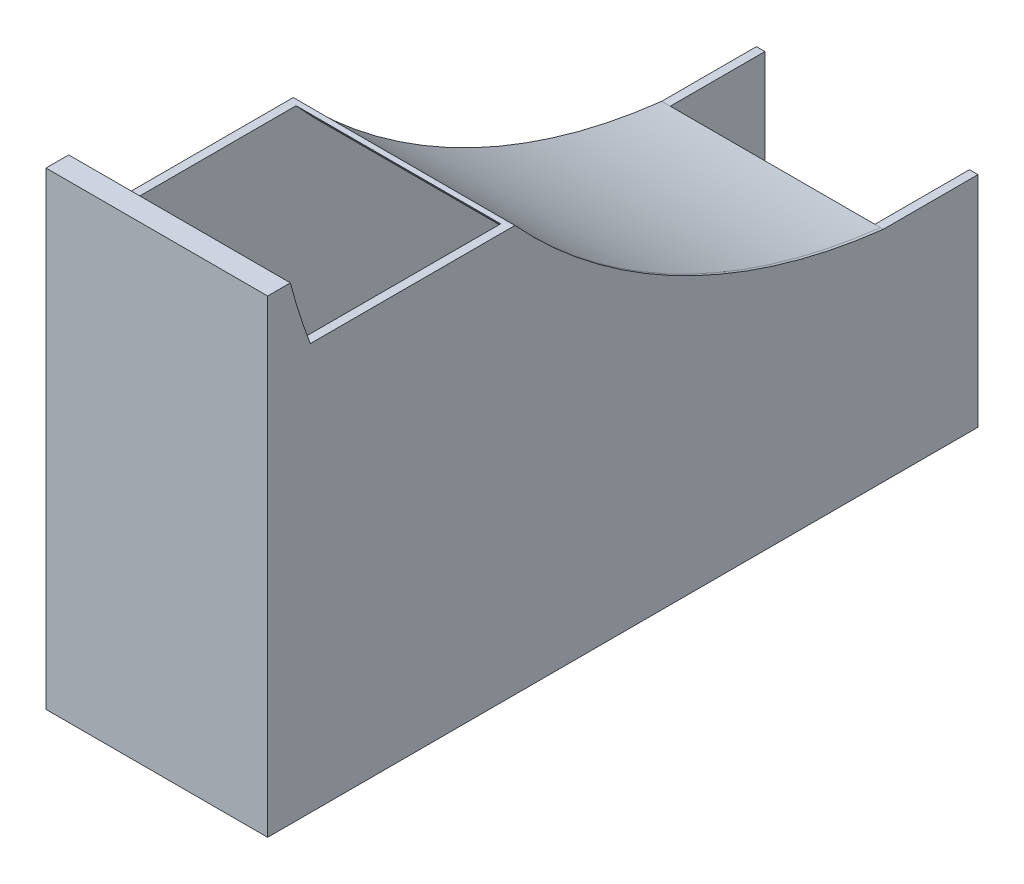
ISO-10303-21;
HEADER;
FILE_DESCRIPTION(('STEP AP214'),'2;1');
FILE_NAME('part.step','',(''),(''),'','','');
FILE_SCHEMA(('AUTOMOTIVE_DESIGN { 1 0 10303 214 1 1 1 1 }'));
ENDSEC;
DATA;
#1=APPLICATION_CONTEXT('core data for automotive mechanical design processes');
#2=APPLICATION_PROTOCOL_DEFINITION('international standard','automotive_design',2000,#1);
#3=PRODUCT_CONTEXT('',#1,'mechanical');
#4=PRODUCT('Part','Part','',(#3));
#5=PRODUCT_RELATED_PRODUCT_CATEGORY('part','',(#4));
#6=PRODUCT_DEFINITION_FORMATION('','',#4);
#7=PRODUCT_DEFINITION_CONTEXT('part definition',#1,'design');
#8=PRODUCT_DEFINITION('design','',#6,#7);
#9=PRODUCT_DEFINITION_SHAPE('','',#8);
#10=(LENGTH_UNIT() NAMED_UNIT(*) SI_UNIT(.MILLI.,.METRE.));
#11=(NAMED_UNIT(*) PLANE_ANGLE_UNIT() SI_UNIT($,.RADIAN.));
#12=(NAMED_UNIT(*) SI_UNIT($,.STERADIAN.) SOLID_ANGLE_UNIT());
#13=UNCERTAINTY_MEASURE_WITH_UNIT(LENGTH_MEASURE(1.E-05),#10,'distance_accuracy_value','');
#14=(GEOMETRIC_REPRESENTATION_CONTEXT(3) GLOBAL_UNCERTAINTY_ASSIGNED_CONTEXT((#13)) GLOBAL_UNIT_ASSIGNED_CONTEXT((#10,
#11,#12)) REPRESENTATION_CONTEXT('',''));
#15=CARTESIAN_POINT('',(0.,0.,0.));
#16=DIRECTION('',(0.,0.,1.));
#17=DIRECTION('',(1.,0.,0.));
#18=AXIS2_PLACEMENT_3D('',#15,#16,#17);
#19=CARTESIAN_POINT('',(17.177257831237,21.9262078687684,0.));
#20=DIRECTION('',(0.,1.,0.));
#21=DIRECTION('',(0.,0.,1.));
#22=AXIS2_PLACEMENT_3D('',#19,#20,#21);
#23=PLANE('',#22);
#24=DIRECTION('',(0.,0.,1.));
#25=VECTOR('',#24,1.);
#26=CARTESIAN_POINT('',(17.177257831237,21.9262078687684,0.));
#27=LINE('',#26,#25);
#28=CARTESIAN_POINT('',(17.177257831237,21.9262078687684,0.));
#29=VERTEX_POINT('',#28);
#30=CARTESIAN_POINT('',(17.177257831237,21.9262078687684,33.3));
#31=VERTEX_POINT('',#30);
#32=EDGE_CURVE('E228',#29,#31,#27,.T.);
#33=ORIENTED_EDGE('',*,*,#32,.T.);
#34=DIRECTION('',(-1.,0.,0.));
#35=VECTOR('',#34,1.);
#36=CARTESIAN_POINT('',(19.177257831237,21.9262078687684,33.3));
#37=LINE('',#36,#35);
#38=CARTESIAN_POINT('',(19.177257831237,21.9262078687684,33.3));
#39=VERTEX_POINT('',#38);
#40=EDGE_CURVE('E56',#39,#31,#37,.T.);
#41=ORIENTED_EDGE('',*,*,#40,.F.);
#42=DIRECTION('',(0.,0.,-1.));
#43=VECTOR('',#42,1.);
#44=CARTESIAN_POINT('',(19.177257831237,21.9262078687684,0.));
#45=LINE('',#44,#43);
#46=CARTESIAN_POINT('',(19.177257831237,21.9262078687684,33.3036906607508));
#47=VERTEX_POINT('',#46);
#48=EDGE_CURVE('E11',#47,#39,#45,.T.);
#49=ORIENTED_EDGE('',*,*,#48,.F.);
#50=DIRECTION('',(1.,0.,0.));
#51=VECTOR('',#50,1.);
#52=CARTESIAN_POINT('',(17.177257831237,21.9262078687684,33.3036906607508));
#53=LINE('',#52,#51);
#54=CARTESIAN_POINT('',(20.177257831237,21.9262078687684,33.3036906607508));
#55=VERTEX_POINT('',#54);
#56=EDGE_CURVE('E251',#47,#55,#53,.T.);
#57=ORIENTED_EDGE('',*,*,#56,.T.);
#58=DIRECTION('',(0.,0.,1.));
#59=VECTOR('',#58,1.);
#60=CARTESIAN_POINT('',(20.177257831237,21.9262078687684,0.));
#61=LINE('',#60,#59);
#62=CARTESIAN_POINT('',(20.177257831237,21.9262078687684,0.));
#63=VERTEX_POINT('',#62);
#64=EDGE_CURVE('E217',#63,#55,#61,.T.);
#65=ORIENTED_EDGE('',*,*,#64,.F.);
#66=DIRECTION('',(1.,0.,0.));
#67=VECTOR('',#66,1.);
#68=CARTESIAN_POINT('',(17.177257831237,21.9262078687684,0.));
#69=LINE('',#68,#67);
#70=EDGE_CURVE('E235',#29,#63,#69,.T.);
#71=ORIENTED_EDGE('',*,*,#70,.F.);
#72=EDGE_LOOP('',(#33,#41,#49,#57,#65,#71));
#73=FACE_BOUND('',#72,.T.);
#74=ADVANCED_FACE('F33',(#73),#23,.T.);
#75=CARTESIAN_POINT('',(17.177257831237,163.829332868768,35.));
#76=DIRECTION('',(1.,0.,0.));
#77=DIRECTION('',(0.,1.,0.));
#78=AXIS2_PLACEMENT_3D('',#75,#76,#77);
#79=PLANE('',#78);
#80=CARTESIAN_POINT('',(17.177257831237,224.196608614478,11.2233780248505));
#81=DIRECTION('',(1.,0.,0.));
#82=DIRECTION('',(0.,1.,0.));
#83=AXIS2_PLACEMENT_3D('',#80,#81,#82);
#84=CIRCLE('',#83,205.459908153991);
#85=CARTESIAN_POINT('',(17.177257831237,19.9262078687684,33.3));
#86=VERTEX_POINT('',#85);
#87=CARTESIAN_POINT('',(17.177257831237,87.9128432367544,164.978082515855));
#88=VERTEX_POINT('',#87);
#89=EDGE_CURVE('E198',#86,#88,#84,.F.);
#90=ORIENTED_EDGE('',*,*,#89,.F.);
#91=DIRECTION('',(0.,-1.,0.));
#92=VECTOR('',#91,1.);
#93=CARTESIAN_POINT('',(17.177257831237,163.829332868768,33.3));
#94=LINE('',#93,#92);
#95=EDGE_CURVE('E196',#31,#86,#94,.T.);
#96=ORIENTED_EDGE('',*,*,#95,.F.);
#97=ORIENTED_EDGE('',*,*,#32,.F.);
#98=DIRECTION('',(0.,1.,0.));
#99=VECTOR('',#98,1.);
#100=CARTESIAN_POINT('',(17.177257831237,-50.0737921312316,0.));
#101=LINE('',#100,#99);
#102=CARTESIAN_POINT('',(17.177257831237,-50.0737921312316,0.));
#103=VERTEX_POINT('',#102);
#104=EDGE_CURVE('E224',#103,#29,#101,.T.);
#105=ORIENTED_EDGE('',*,*,#104,.F.);
#106=DIRECTION('',(0.,0.,-1.));
#107=VECTOR('',#106,1.);
#108=CARTESIAN_POINT('',(17.177257831237,-50.0737921312316,0.));
#109=LINE('',#108,#107);
#110=CARTESIAN_POINT('',(17.177257831237,-50.0737921312316,35.));
#111=VERTEX_POINT('',#110);
#112=EDGE_CURVE('E221',#111,#103,#109,.T.);
#113=ORIENTED_EDGE('',*,*,#112,.F.);
#114=CARTESIAN_POINT('',(17.177257831237,163.829332868768,35.));
#115=DIRECTION('',(1.,0.,0.));
#116=DIRECTION('',(0.,1.,0.));
#117=AXIS2_PLACEMENT_3D('',#114,#115,#116);
#118=CIRCLE('',#117,213.903125);
#119=CARTESIAN_POINT('',(17.177257831237,87.9128432367544,234.978082515855));
#120=VERTEX_POINT('',#119);
#121=EDGE_CURVE('E232',#120,#111,#118,.T.);
#122=ORIENTED_EDGE('',*,*,#121,.F.);
#123=DIRECTION('',(0.,0.,1.));
#124=VECTOR('',#123,1.);
#125=CARTESIAN_POINT('',(17.177257831237,87.9128432367544,234.978082515855));
#126=LINE('',#125,#124);
#127=EDGE_CURVE('E230',#88,#120,#126,.T.);
#128=ORIENTED_EDGE('',*,*,#127,.F.);
#129=EDGE_LOOP('',(#90,#96,#97,#105,#113,#122,#128));
#130=FACE_BOUND('',#129,.T.);
#131=ADVANCED_FACE('F313',(#130),#79,.F.);
#132=CARTESIAN_POINT('',(-54.822742168763,163.829332868768,35.0000000000004));
#133=DIRECTION('',(-1.,0.,0.));
#134=DIRECTION('',(0.,-1.,0.));
#135=AXIS2_PLACEMENT_3D('',#132,#133,#134);
#136=PLANE('',#135);
#137=CARTESIAN_POINT('',(-54.822742168763,224.196608614478,11.2233780248505));
#138=DIRECTION('',(1.,0.,0.));
#139=DIRECTION('',(0.,1.,0.));
#140=AXIS2_PLACEMENT_3D('',#137,#138,#139);
#141=CIRCLE('',#140,205.459908153991);
#142=CARTESIAN_POINT('',(-54.822742168763,87.9128432367544,164.978082515855));
#143=VERTEX_POINT('',#142);
#144=CARTESIAN_POINT('',(-54.822742168763,19.9262078687684,33.3));
#145=VERTEX_POINT('',#144);
#146=EDGE_CURVE('E186',#143,#145,#141,.T.);
#147=ORIENTED_EDGE('',*,*,#146,.F.);
#148=DIRECTION('',(0.,0.,-1.));
#149=VECTOR('',#148,1.);
#150=CARTESIAN_POINT('',(-54.822742168763,87.9128432367544,234.978082515855));
#151=LINE('',#150,#149);
#152=CARTESIAN_POINT('',(-54.822742168763,87.9128432367544,234.978082515855));
#153=VERTEX_POINT('',#152);
#154=EDGE_CURVE('E160',#153,#143,#151,.T.);
#155=ORIENTED_EDGE('',*,*,#154,.F.);
#156=CARTESIAN_POINT('',(-54.822742168763,163.829332868768,35.0000000000004));
#157=DIRECTION('',(-1.,0.,0.));
#158=DIRECTION('',(0.,-1.,0.));
#159=AXIS2_PLACEMENT_3D('',#156,#157,#158);
#160=CIRCLE('',#159,213.903124999999);
#161=CARTESIAN_POINT('',(-54.822742168763,-50.0737921312316,35.));
#162=VERTEX_POINT('',#161);
#163=EDGE_CURVE('E206',#162,#153,#160,.T.);
#164=ORIENTED_EDGE('',*,*,#163,.F.);
#165=DIRECTION('',(0.,0.,1.));
#166=VECTOR('',#165,1.);
#167=CARTESIAN_POINT('',(-54.822742168763,-50.0737921312316,0.));
#168=LINE('',#167,#166);
#169=CARTESIAN_POINT('',(-54.822742168763,-50.0737921312316,0.));
#170=VERTEX_POINT('',#169);
#171=EDGE_CURVE('E203',#170,#162,#168,.T.);
#172=ORIENTED_EDGE('',*,*,#171,.F.);
#173=DIRECTION('',(0.,-1.,0.));
#174=VECTOR('',#173,1.);
#175=CARTESIAN_POINT('',(-54.822742168763,-50.0737921312316,0.));
#176=LINE('',#175,#174);
#177=CARTESIAN_POINT('',(-54.822742168763,21.9262078687684,0.));
#178=VERTEX_POINT('',#177);
#179=EDGE_CURVE('E157',#178,#170,#176,.T.);
#180=ORIENTED_EDGE('',*,*,#179,.F.);
#181=DIRECTION('',(0.,0.,-1.));
#182=VECTOR('',#181,1.);
#183=CARTESIAN_POINT('',(-54.822742168763,21.9262078687684,0.));
#184=LINE('',#183,#182);
#185=CARTESIAN_POINT('',(-54.822742168763,21.9262078687684,33.3));
#186=VERTEX_POINT('',#185);
#187=EDGE_CURVE('E150',#186,#178,#184,.T.);
#188=ORIENTED_EDGE('',*,*,#187,.F.);
#189=DIRECTION('',(0.,1.,0.));
#190=VECTOR('',#189,1.);
#191=CARTESIAN_POINT('',(-54.822742168763,21.9262078687684,33.3));
#192=LINE('',#191,#190);
#193=EDGE_CURVE('E154',#145,#186,#192,.T.);
#194=ORIENTED_EDGE('',*,*,#193,.F.);
#195=EDGE_LOOP('',(#147,#155,#164,#172,#180,#188,#194));
#196=FACE_BOUND('',#195,.T.);
#197=ADVANCED_FACE('F152',(#196),#136,.F.);
#198=CARTESIAN_POINT('',(-444.735603805592,-50.0737921312316,0.));
#199=DIRECTION('',(0.,1.,0.));
#200=DIRECTION('',(0.,0.,1.));
#201=AXIS2_PLACEMENT_3D('',#198,#199,#200);
#202=PLANE('',#201);
#203=DIRECTION('',(1.,0.,0.));
#204=VECTOR('',#203,1.);
#205=CARTESIAN_POINT('',(-444.735603805592,-50.0737921312316,0.));
#206=LINE('',#205,#204);
#207=EDGE_CURVE('E257',#170,#103,#206,.T.);
#208=ORIENTED_EDGE('',*,*,#207,.F.);
#209=ORIENTED_EDGE('',*,*,#171,.T.);
#210=DIRECTION('',(1.,0.,0.));
#211=VECTOR('',#210,1.);
#212=CARTESIAN_POINT('',(-444.735603805592,-50.0737921312316,35.));
#213=LINE('',#212,#211);
#214=EDGE_CURVE('E263',#162,#111,#213,.T.);
#215=ORIENTED_EDGE('',*,*,#214,.T.);
#216=ORIENTED_EDGE('',*,*,#112,.T.);
#217=EDGE_LOOP('',(#208,#209,#215,#216));
#218=FACE_BOUND('',#217,.T.);
#219=ADVANCED_FACE('F318',(#218),#202,.T.);
#220=CARTESIAN_POINT('',(-57.822742168763,109.926207868768,250.));
#221=DIRECTION('',(0.,-1.,0.));
#222=DIRECTION('',(0.,0.,-1.));
#223=AXIS2_PLACEMENT_3D('',#220,#221,#222);
#224=PLANE('',#223);
#225=DIRECTION('',(1.,0.,0.));
#226=VECTOR('',#225,1.);
#227=CARTESIAN_POINT('',(-444.735603805592,109.926207868768,242.));
#228=LINE('',#227,#226);
#229=CARTESIAN_POINT('',(-57.822742168763,109.926207868768,242.));
#230=VERTEX_POINT('',#229);
#231=CARTESIAN_POINT('',(20.177257831237,109.926207868768,242.));
#232=VERTEX_POINT('',#231);
#233=EDGE_CURVE('E261',#230,#232,#228,.T.);
#234=ORIENTED_EDGE('',*,*,#233,.F.);
#235=DIRECTION('',(0.,0.,-1.));
#236=VECTOR('',#235,1.);
#237=CARTESIAN_POINT('',(-57.822742168763,109.926207868768,250.));
#238=LINE('',#237,#236);
#239=CARTESIAN_POINT('',(-57.822742168763,109.926207868768,250.));
#240=VERTEX_POINT('',#239);
#241=EDGE_CURVE('E41',#240,#230,#238,.T.);
#242=ORIENTED_EDGE('',*,*,#241,.F.);
#243=DIRECTION('',(-1.,0.,0.));
#244=VECTOR('',#243,1.);
#245=CARTESIAN_POINT('',(-57.822742168763,109.926207868768,250.));
#246=LINE('',#245,#244);
#247=CARTESIAN_POINT('',(20.177257831237,109.926207868768,250.));
#248=VERTEX_POINT('',#247);
#249=EDGE_CURVE('E266',#248,#240,#246,.T.);
#250=ORIENTED_EDGE('',*,*,#249,.F.);
#251=DIRECTION('',(0.,0.,-1.));
#252=VECTOR('',#251,1.);
#253=CARTESIAN_POINT('',(20.177257831237,109.926207868768,250.));
#254=LINE('',#253,#252);
#255=EDGE_CURVE('E276',#248,#232,#254,.T.);
#256=ORIENTED_EDGE('',*,*,#255,.T.);
#257=EDGE_LOOP('',(#234,#242,#250,#256));
#258=FACE_BOUND('',#257,.T.);
#259=ADVANCED_FACE('F35',(#258),#224,.F.);
#260=CARTESIAN_POINT('',(-57.822742168763,109.926207868768,250.));
#261=DIRECTION('',(1.,0.,0.));
#262=DIRECTION('',(0.,1.,0.));
#263=AXIS2_PLACEMENT_3D('',#260,#261,#262);
#264=PLANE('',#263);
#265=DIRECTION('',(0.,0.,-1.));
#266=VECTOR('',#265,1.);
#267=CARTESIAN_POINT('',(-57.822742168763,21.9262078687684,0.));
#268=LINE('',#267,#266);
#269=CARTESIAN_POINT('',(-57.822742168763,21.9262078687684,33.3));
#270=VERTEX_POINT('',#269);
#271=CARTESIAN_POINT('',(-57.822742168763,21.9262078687684,0.));
#272=VERTEX_POINT('',#271);
#273=EDGE_CURVE('E167',#270,#272,#268,.T.);
#274=ORIENTED_EDGE('',*,*,#273,.T.);
#275=DIRECTION('',(0.,-1.,0.));
#276=VECTOR('',#275,1.);
#277=CARTESIAN_POINT('',(-57.822742168763,109.926207868768,0.));
#278=LINE('',#277,#276);
#279=CARTESIAN_POINT('',(-57.822742168763,-55.0737921312316,0.));
#280=VERTEX_POINT('',#279);
#281=EDGE_CURVE('E265',#272,#280,#278,.T.);
#282=ORIENTED_EDGE('',*,*,#281,.T.);
#283=DIRECTION('',(0.,0.,-1.));
#284=VECTOR('',#283,1.);
#285=CARTESIAN_POINT('',(-57.822742168763,-55.0737921312316,250.));
#286=LINE('',#285,#284);
#287=CARTESIAN_POINT('',(-57.822742168763,-55.0737921312316,250.));
#288=VERTEX_POINT('',#287);
#289=EDGE_CURVE('E286',#288,#280,#286,.T.);
#290=ORIENTED_EDGE('',*,*,#289,.F.);
#291=DIRECTION('',(0.,-1.,0.));
#292=VECTOR('',#291,1.);
#293=CARTESIAN_POINT('',(-57.822742168763,109.926207868768,250.));
#294=LINE('',#293,#292);
#295=EDGE_CURVE('E269',#240,#288,#294,.T.);
#296=ORIENTED_EDGE('',*,*,#295,.F.);
#297=ORIENTED_EDGE('',*,*,#241,.T.);
#298=CARTESIAN_POINT('',(-57.822742168763,163.829332868768,35.));
#299=DIRECTION('',(1.,0.,0.));
#300=DIRECTION('',(0.,1.,0.));
#301=AXIS2_PLACEMENT_3D('',#298,#299,#300);
#302=CIRCLE('',#301,213.903125);
#303=CARTESIAN_POINT('',(-57.822742168763,87.9128432367544,234.978082515855));
#304=VERTEX_POINT('',#303);
#305=EDGE_CURVE('E246',#230,#304,#302,.T.);
#306=ORIENTED_EDGE('',*,*,#305,.T.);
#307=DIRECTION('',(0.,0.,-1.));
#308=VECTOR('',#307,1.);
#309=CARTESIAN_POINT('',(-57.822742168763,87.9128432367544,234.978082515855));
#310=LINE('',#309,#308);
#311=CARTESIAN_POINT('',(-57.822742168763,87.9128432367544,162.978082515855));
#312=VERTEX_POINT('',#311);
#313=EDGE_CURVE('E202',#304,#312,#310,.T.);
#314=ORIENTED_EDGE('',*,*,#313,.T.);
#315=CARTESIAN_POINT('',(-57.822742168763,227.638958860331,10.2508334319181));
#316=DIRECTION('',(1.,0.,0.));
#317=DIRECTION('',(0.,-1.,0.));
#318=AXIS2_PLACEMENT_3D('',#315,#316,#317);
#319=CIRCLE('',#318,207.);
#320=EDGE_CURVE('E214',#312,#270,#319,.T.);
#321=ORIENTED_EDGE('',*,*,#320,.T.);
#322=EDGE_LOOP('',(#274,#282,#290,#296,#297,#306,#314,#321));
#323=FACE_BOUND('',#322,.T.);
#324=ADVANCED_FACE('F291',(#323),#264,.F.);
#325=CARTESIAN_POINT('',(-57.822742168763,-55.0737921312316,250.));
#326=DIRECTION('',(0.,1.,0.));
#327=DIRECTION('',(0.,0.,1.));
#328=AXIS2_PLACEMENT_3D('',#325,#326,#327);
#329=PLANE('',#328);
#330=DIRECTION('',(1.,0.,0.));
#331=VECTOR('',#330,1.);
#332=CARTESIAN_POINT('',(-57.822742168763,-55.0737921312316,0.));
#333=LINE('',#332,#331);
#334=CARTESIAN_POINT('',(20.177257831237,-55.0737921312316,0.));
#335=VERTEX_POINT('',#334);
#336=EDGE_CURVE('E278',#280,#335,#333,.T.);
#337=ORIENTED_EDGE('',*,*,#336,.T.);
#338=DIRECTION('',(0.,0.,-1.));
#339=VECTOR('',#338,1.);
#340=CARTESIAN_POINT('',(20.177257831237,-55.0737921312316,250.));
#341=LINE('',#340,#339);
#342=CARTESIAN_POINT('',(20.177257831237,-55.0737921312316,250.));
#343=VERTEX_POINT('',#342);
#344=EDGE_CURVE('E283',#343,#335,#341,.T.);
#345=ORIENTED_EDGE('',*,*,#344,.F.);
#346=DIRECTION('',(1.,0.,0.));
#347=VECTOR('',#346,1.);
#348=CARTESIAN_POINT('',(-57.822742168763,-55.0737921312316,250.));
#349=LINE('',#348,#347);
#350=EDGE_CURVE('E272',#288,#343,#349,.T.);
#351=ORIENTED_EDGE('',*,*,#350,.F.);
#352=ORIENTED_EDGE('',*,*,#289,.T.);
#353=EDGE_LOOP('',(#337,#345,#351,#352));
#354=FACE_BOUND('',#353,.T.);
#355=ADVANCED_FACE('F333',(#354),#329,.F.);
#356=CARTESIAN_POINT('',(20.177257831237,-55.0737921312316,250.));
#357=DIRECTION('',(-1.,0.,0.));
#358=DIRECTION('',(0.,-1.,0.));
#359=AXIS2_PLACEMENT_3D('',#356,#357,#358);
#360=PLANE('',#359);
#361=DIRECTION('',(0.,1.,0.));
#362=VECTOR('',#361,1.);
#363=CARTESIAN_POINT('',(20.177257831237,-55.0737921312316,0.));
#364=LINE('',#363,#362);
#365=EDGE_CURVE('E270',#335,#63,#364,.T.);
#366=ORIENTED_EDGE('',*,*,#365,.T.);
#367=ORIENTED_EDGE('',*,*,#64,.T.);
#368=CARTESIAN_POINT('',(20.177257831237,227.6384980621,10.2504118610959));
#369=DIRECTION('',(-1.,0.,0.));
#370=DIRECTION('',(0.,-1.,0.));
#371=AXIS2_PLACEMENT_3D('',#368,#369,#370);
#372=CIRCLE('',#371,207.);
#373=CARTESIAN_POINT('',(20.177257831237,87.9128432367544,162.978082515855));
#374=VERTEX_POINT('',#373);
#375=EDGE_CURVE('E238',#55,#374,#372,.T.);
#376=ORIENTED_EDGE('',*,*,#375,.T.);
#377=DIRECTION('',(0.,0.,1.));
#378=VECTOR('',#377,1.);
#379=CARTESIAN_POINT('',(20.177257831237,87.9128432367544,234.978082515855));
#380=LINE('',#379,#378);
#381=CARTESIAN_POINT('',(20.177257831237,87.9128432367544,234.978082515855));
#382=VERTEX_POINT('',#381);
#383=EDGE_CURVE('E225',#374,#382,#380,.T.);
#384=ORIENTED_EDGE('',*,*,#383,.T.);
#385=CARTESIAN_POINT('',(20.177257831237,163.829332868768,35.));
#386=DIRECTION('',(1.,0.,0.));
#387=DIRECTION('',(0.,1.,0.));
#388=AXIS2_PLACEMENT_3D('',#385,#386,#387);
#389=CIRCLE('',#388,213.903125);
#390=EDGE_CURVE('E255',#232,#382,#389,.T.);
#391=ORIENTED_EDGE('',*,*,#390,.F.);
#392=ORIENTED_EDGE('',*,*,#255,.F.);
#393=DIRECTION('',(0.,1.,0.));
#394=VECTOR('',#393,1.);
#395=CARTESIAN_POINT('',(20.177257831237,-55.0737921312316,250.));
#396=LINE('',#395,#394);
#397=EDGE_CURVE('E274',#343,#248,#396,.T.);
#398=ORIENTED_EDGE('',*,*,#397,.F.);
#399=ORIENTED_EDGE('',*,*,#344,.T.);
#400=EDGE_LOOP('',(#366,#367,#376,#384,#391,#392,#398,#399));
#401=FACE_BOUND('',#400,.T.);
#402=ADVANCED_FACE('F302',(#401),#360,.F.);
#403=CARTESIAN_POINT('',(0.,0.,250.));
#404=DIRECTION('',(0.,0.,1.));
#405=DIRECTION('',(1.,0.,0.));
#406=AXIS2_PLACEMENT_3D('',#403,#404,#405);
#407=PLANE('',#406);
#408=ORIENTED_EDGE('',*,*,#249,.T.);
#409=ORIENTED_EDGE('',*,*,#295,.T.);
#410=ORIENTED_EDGE('',*,*,#350,.T.);
#411=ORIENTED_EDGE('',*,*,#397,.T.);
#412=EDGE_LOOP('',(#408,#409,#410,#411));
#413=FACE_BOUND('',#412,.T.);
#414=ADVANCED_FACE('F335',(#413),#407,.T.);
#415=CARTESIAN_POINT('',(0.,0.,0.));
#416=DIRECTION('',(0.,0.,1.));
#417=DIRECTION('',(1.,0.,0.));
#418=AXIS2_PLACEMENT_3D('',#415,#416,#417);
#419=PLANE('',#418);
#420=ORIENTED_EDGE('',*,*,#281,.F.);
#421=DIRECTION('',(-1.,0.,0.));
#422=VECTOR('',#421,1.);
#423=CARTESIAN_POINT('',(-54.822742168763,21.9262078687684,0.));
#424=LINE('',#423,#422);
#425=EDGE_CURVE('E171',#178,#272,#424,.T.);
#426=ORIENTED_EDGE('',*,*,#425,.F.);
#427=ORIENTED_EDGE('',*,*,#179,.T.);
#428=ORIENTED_EDGE('',*,*,#207,.T.);
#429=ORIENTED_EDGE('',*,*,#104,.T.);
#430=ORIENTED_EDGE('',*,*,#70,.T.);
#431=ORIENTED_EDGE('',*,*,#365,.F.);
#432=ORIENTED_EDGE('',*,*,#336,.F.);
#433=EDGE_LOOP('',(#420,#426,#427,#428,#429,#430,#431,#432));
#434=FACE_BOUND('',#433,.T.);
#435=ADVANCED_FACE('F325',(#434),#419,.F.);
#436=CARTESIAN_POINT('',(-444.735603805592,163.829332868768,35.));
#437=DIRECTION('',(1.,0.,0.));
#438=DIRECTION('',(0.,1.,0.));
#439=AXIS2_PLACEMENT_3D('',#436,#437,#438);
#440=CYLINDRICAL_SURFACE('',#439,213.903125);
#441=DIRECTION('',(-1.,0.,0.));
#442=VECTOR('',#441,1.);
#443=CARTESIAN_POINT('',(-54.822742168763,87.9128432367544,234.978082515855));
#444=LINE('',#443,#442);
#445=EDGE_CURVE('E172',#153,#304,#444,.T.);
#446=ORIENTED_EDGE('',*,*,#445,.T.);
#447=ORIENTED_EDGE('',*,*,#305,.F.);
#448=ORIENTED_EDGE('',*,*,#233,.T.);
#449=ORIENTED_EDGE('',*,*,#390,.T.);
#450=DIRECTION('',(1.,0.,0.));
#451=VECTOR('',#450,1.);
#452=CARTESIAN_POINT('',(17.177257831237,87.9128432367544,234.978082515855));
#453=LINE('',#452,#451);
#454=EDGE_CURVE('E243',#120,#382,#453,.T.);
#455=ORIENTED_EDGE('',*,*,#454,.F.);
#456=ORIENTED_EDGE('',*,*,#121,.T.);
#457=ORIENTED_EDGE('',*,*,#214,.F.);
#458=ORIENTED_EDGE('',*,*,#163,.T.);
#459=EDGE_LOOP('',(#446,#447,#448,#449,#455,#456,#457,#458));
#460=FACE_BOUND('',#459,.T.);
#461=ADVANCED_FACE('F299',(#460),#440,.F.);
#462=CARTESIAN_POINT('',(17.177257831237,87.9128432367544,234.978082515855));
#463=DIRECTION('',(0.,1.,0.));
#464=DIRECTION('',(-1.,0.,0.));
#465=AXIS2_PLACEMENT_3D('',#462,#463,#464);
#466=PLANE('',#465);
#467=DIRECTION('',(-1.,0.,0.));
#468=VECTOR('',#467,1.);
#469=CARTESIAN_POINT('',(19.177257831237,87.9128432367544,164.978082515855));
#470=LINE('',#469,#468);
#471=EDGE_CURVE('E193',#88,#143,#470,.T.);
#472=ORIENTED_EDGE('',*,*,#471,.F.);
#473=ORIENTED_EDGE('',*,*,#127,.T.);
#474=ORIENTED_EDGE('',*,*,#454,.T.);
#475=ORIENTED_EDGE('',*,*,#383,.F.);
#476=DIRECTION('',(1.,0.,0.));
#477=VECTOR('',#476,1.);
#478=CARTESIAN_POINT('',(17.177257831237,87.9128432367544,162.978082515855));
#479=LINE('',#478,#477);
#480=CARTESIAN_POINT('',(19.177257831237,87.9128432367544,162.978082515855));
#481=VERTEX_POINT('',#480);
#482=EDGE_CURVE('E250',#481,#374,#479,.T.);
#483=ORIENTED_EDGE('',*,*,#482,.F.);
#484=EDGE_CURVE('E247',#312,#481,#479,.T.);
#485=ORIENTED_EDGE('',*,*,#484,.F.);
#486=ORIENTED_EDGE('',*,*,#313,.F.);
#487=ORIENTED_EDGE('',*,*,#445,.F.);
#488=ORIENTED_EDGE('',*,*,#154,.T.);
#489=EDGE_LOOP('',(#472,#473,#474,#475,#483,#485,#486,#487,#488));
#490=FACE_BOUND('',#489,.T.);
#491=ADVANCED_FACE('F308',(#490),#466,.T.);
#492=CARTESIAN_POINT('',(17.177257831237,227.6384980621,10.2504118610959));
#493=DIRECTION('',(1.,0.,0.));
#494=DIRECTION('',(0.,1.,0.));
#495=AXIS2_PLACEMENT_3D('',#492,#493,#494);
#496=CYLINDRICAL_SURFACE('',#495,207.);
#497=CARTESIAN_POINT('',(19.177257831237,227.6384980621,10.2504118610959));
#498=DIRECTION('',(1.,0.,0.));
#499=DIRECTION('',(0.,1.,0.));
#500=AXIS2_PLACEMENT_3D('',#497,#498,#499);
#501=CIRCLE('',#500,207.);
#502=EDGE_CURVE('E48',#481,#47,#501,.T.);
#503=ORIENTED_EDGE('',*,*,#502,.F.);
#504=ORIENTED_EDGE('',*,*,#482,.T.);
#505=ORIENTED_EDGE('',*,*,#375,.F.);
#506=ORIENTED_EDGE('',*,*,#56,.F.);
#507=EDGE_LOOP('',(#503,#504,#505,#506));
#508=FACE_BOUND('',#507,.T.);
#509=ADVANCED_FACE('F329',(#508),#496,.F.);
#510=CARTESIAN_POINT('',(-54.822742168763,21.9262078687684,0.));
#511=DIRECTION('',(0.,1.,0.));
#512=DIRECTION('',(-1.,0.,0.));
#513=AXIS2_PLACEMENT_3D('',#510,#511,#512);
#514=PLANE('',#513);
#515=ORIENTED_EDGE('',*,*,#273,.F.);
#516=DIRECTION('',(-1.,0.,0.));
#517=VECTOR('',#516,1.);
#518=CARTESIAN_POINT('',(-54.822742168763,21.9262078687684,33.3));
#519=LINE('',#518,#517);
#520=EDGE_CURVE('E163',#186,#270,#519,.T.);
#521=ORIENTED_EDGE('',*,*,#520,.F.);
#522=ORIENTED_EDGE('',*,*,#187,.T.);
#523=ORIENTED_EDGE('',*,*,#425,.T.);
#524=EDGE_LOOP('',(#515,#521,#522,#523));
#525=FACE_BOUND('',#524,.T.);
#526=ADVANCED_FACE('F165',(#525),#514,.T.);
#527=CARTESIAN_POINT('',(-54.822742168763,227.638958860331,10.2508334319181));
#528=DIRECTION('',(-1.,0.,0.));
#529=DIRECTION('',(0.,-1.,0.));
#530=AXIS2_PLACEMENT_3D('',#527,#528,#529);
#531=CYLINDRICAL_SURFACE('',#530,207.);
#532=ORIENTED_EDGE('',*,*,#320,.F.);
#533=ORIENTED_EDGE('',*,*,#484,.T.);
#534=CARTESIAN_POINT('',(19.177257831237,227.638958860331,10.2508334319181));
#535=DIRECTION('',(-1.,0.,0.));
#536=DIRECTION('',(0.,1.,0.));
#537=AXIS2_PLACEMENT_3D('',#534,#535,#536);
#538=CIRCLE('',#537,207.);
#539=EDGE_CURVE('E180',#39,#481,#538,.T.);
#540=ORIENTED_EDGE('',*,*,#539,.F.);
#541=ORIENTED_EDGE('',*,*,#40,.T.);
#542=EDGE_CURVE('E175',#31,#186,#37,.T.);
#543=ORIENTED_EDGE('',*,*,#542,.T.);
#544=ORIENTED_EDGE('',*,*,#520,.T.);
#545=EDGE_LOOP('',(#532,#533,#540,#541,#543,#544));
#546=FACE_BOUND('',#545,.T.);
#547=ADVANCED_FACE('F176',(#546),#531,.F.);
#548=CARTESIAN_POINT('',(19.177257831237,224.196608614478,11.2233780248505));
#549=DIRECTION('',(-1.,0.,0.));
#550=DIRECTION('',(0.,-1.,0.));
#551=AXIS2_PLACEMENT_3D('',#548,#549,#550);
#552=CYLINDRICAL_SURFACE('',#551,205.459908153991);
#553=DIRECTION('',(-1.,0.,0.));
#554=VECTOR('',#553,1.);
#555=CARTESIAN_POINT('',(19.177257831237,19.9262078687684,33.3));
#556=LINE('',#555,#554);
#557=EDGE_CURVE('E184',#86,#145,#556,.T.);
#558=ORIENTED_EDGE('',*,*,#557,.F.);
#559=ORIENTED_EDGE('',*,*,#89,.T.);
#560=ORIENTED_EDGE('',*,*,#471,.T.);
#561=ORIENTED_EDGE('',*,*,#146,.T.);
#562=EDGE_LOOP('',(#558,#559,#560,#561));
#563=FACE_BOUND('',#562,.T.);
#564=ADVANCED_FACE('F321',(#563),#552,.T.);
#565=CARTESIAN_POINT('',(19.177257831237,21.9262078687684,33.3));
#566=DIRECTION('',(0.,0.,1.));
#567=DIRECTION('',(1.,0.,0.));
#568=AXIS2_PLACEMENT_3D('',#565,#566,#567);
#569=PLANE('',#568);
#570=ORIENTED_EDGE('',*,*,#542,.F.);
#571=ORIENTED_EDGE('',*,*,#95,.T.);
#572=ORIENTED_EDGE('',*,*,#557,.T.);
#573=ORIENTED_EDGE('',*,*,#193,.T.);
#574=EDGE_LOOP('',(#570,#571,#572,#573));
#575=FACE_BOUND('',#574,.T.);
#576=ADVANCED_FACE('F182',(#575),#569,.F.);
#577=CARTESIAN_POINT('',(19.177257831237,227.638958860331,10.2508334319181));
#578=DIRECTION('',(1.,0.,0.));
#579=DIRECTION('',(0.,1.,0.));
#580=AXIS2_PLACEMENT_3D('',#577,#578,#579);
#581=PLANE('',#580);
#582=ORIENTED_EDGE('',*,*,#539,.T.);
#583=ORIENTED_EDGE('',*,*,#502,.T.);
#584=ORIENTED_EDGE('',*,*,#48,.T.);
#585=EDGE_LOOP('',(#582,#583,#584));
#586=FACE_BOUND('',#585,.T.);
#587=ADVANCED_FACE('F328',(#586),#581,.T.);
#588=CLOSED_SHELL('',(#74,#131,#197,#219,#259,#324,#355,#402,#414,#435,#461,#491,#509,#526,#547,
#564,#576,#587));
#589=MANIFOLD_SOLID_BREP('B2',#588);
#590=ADVANCED_BREP_SHAPE_REPRESENTATION('',(#18,#589),#14);
#591=SHAPE_DEFINITION_REPRESENTATION(#9,#590);
ENDSEC;
END-ISO-10303-21;
